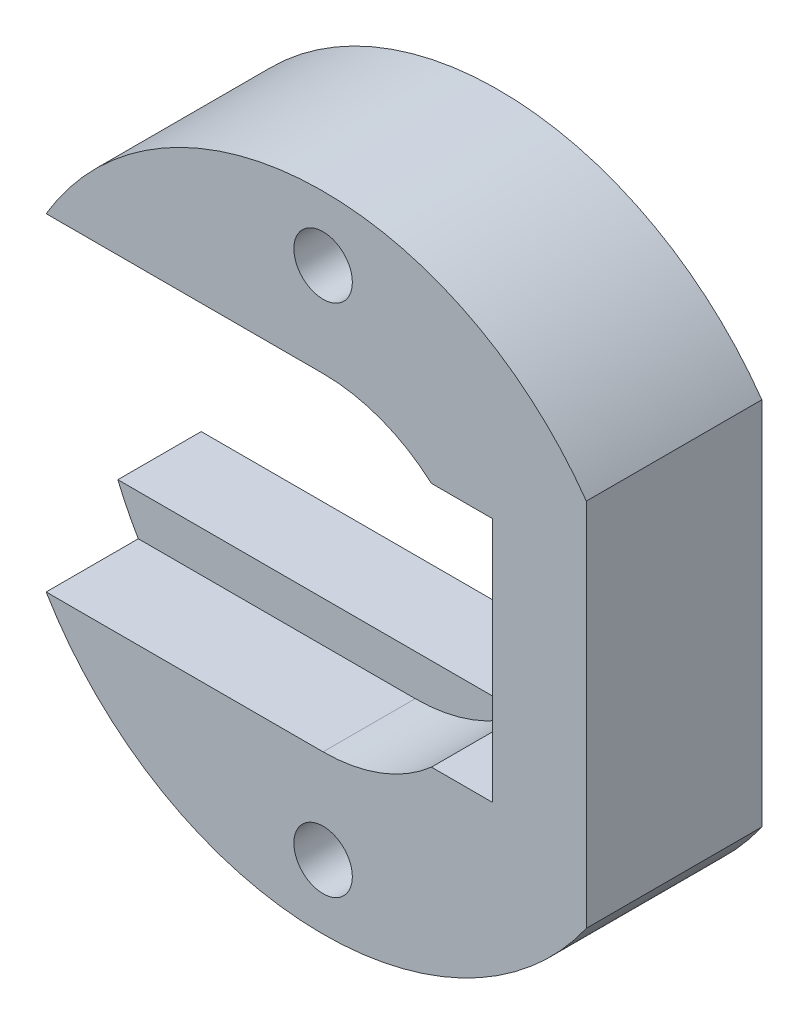
ISO-10303-21;
HEADER;
FILE_DESCRIPTION(('STEP AP214'),'2;1');
FILE_NAME('part.step','',(''),(''),'','','');
FILE_SCHEMA(('AUTOMOTIVE_DESIGN { 1 0 10303 214 1 1 1 1 }'));
ENDSEC;
DATA;
#1=APPLICATION_CONTEXT('core data for automotive mechanical design processes');
#2=APPLICATION_PROTOCOL_DEFINITION('international standard','automotive_design',2000,#1);
#3=PRODUCT_CONTEXT('',#1,'mechanical');
#4=PRODUCT('Part','Part','',(#3));
#5=PRODUCT_RELATED_PRODUCT_CATEGORY('part','',(#4));
#6=PRODUCT_DEFINITION_FORMATION('','',#4);
#7=PRODUCT_DEFINITION_CONTEXT('part definition',#1,'design');
#8=PRODUCT_DEFINITION('design','',#6,#7);
#9=PRODUCT_DEFINITION_SHAPE('','',#8);
#10=(LENGTH_UNIT() NAMED_UNIT(*) SI_UNIT(.MILLI.,.METRE.));
#11=(NAMED_UNIT(*) PLANE_ANGLE_UNIT() SI_UNIT($,.RADIAN.));
#12=(NAMED_UNIT(*) SI_UNIT($,.STERADIAN.) SOLID_ANGLE_UNIT());
#13=UNCERTAINTY_MEASURE_WITH_UNIT(LENGTH_MEASURE(1.E-05),#10,'distance_accuracy_value','');
#14=(GEOMETRIC_REPRESENTATION_CONTEXT(3) GLOBAL_UNCERTAINTY_ASSIGNED_CONTEXT((#13)) GLOBAL_UNIT_ASSIGNED_CONTEXT((#10,
#11,#12)) REPRESENTATION_CONTEXT('',''));
#15=CARTESIAN_POINT('',(0.,0.,0.));
#16=DIRECTION('',(0.,0.,1.));
#17=DIRECTION('',(1.,0.,0.));
#18=AXIS2_PLACEMENT_3D('',#15,#16,#17);
#19=CARTESIAN_POINT('',(-1.66533453693773E-13,0.,19.05));
#20=DIRECTION('',(0.,0.,-0.999999999999999));
#21=DIRECTION('',(-1.,0.,0.));
#22=AXIS2_PLACEMENT_3D('',#19,#20,#21);
#23=CYLINDRICAL_SURFACE('',#22,34.925);
#24=CARTESIAN_POINT('',(-1.66533453693773E-13,0.,19.05));
#25=DIRECTION('',(0.,0.,0.999999999999999));
#26=DIRECTION('',(1.,0.,0.));
#27=AXIS2_PLACEMENT_3D('',#24,#25,#26);
#28=CIRCLE('',#27,34.925);
#29=CARTESIAN_POINT('',(28.5749999999999,20.0804631420692,19.05));
#30=VERTEX_POINT('',#29);
#31=CARTESIAN_POINT('',(-30.0603929615036,17.78,19.05));
#32=VERTEX_POINT('',#31);
#33=EDGE_CURVE('E134',#30,#32,#28,.T.);
#34=ORIENTED_EDGE('',*,*,#33,.F.);
#35=DIRECTION('',(0.,0.,-0.999999999999999));
#36=VECTOR('',#35,1.);
#37=CARTESIAN_POINT('',(28.5749999999999,20.0804631420692,19.05));
#38=LINE('',#37,#36);
#39=CARTESIAN_POINT('',(28.575,20.0804631420692,0.));
#40=VERTEX_POINT('',#39);
#41=EDGE_CURVE('E122',#30,#40,#38,.T.);
#42=ORIENTED_EDGE('',*,*,#41,.T.);
#43=CARTESIAN_POINT('',(0.,0.,0.));
#44=DIRECTION('',(0.,0.,0.999999999999999));
#45=DIRECTION('',(1.,0.,0.));
#46=AXIS2_PLACEMENT_3D('',#43,#44,#45);
#47=CIRCLE('',#46,34.925);
#48=CARTESIAN_POINT('',(-32.2789931689328,13.335,0.));
#49=VERTEX_POINT('',#48);
#50=EDGE_CURVE('E131',#40,#49,#47,.T.);
#51=ORIENTED_EDGE('',*,*,#50,.T.);
#52=DIRECTION('',(0.,0.,-0.999999999999999));
#53=VECTOR('',#52,1.);
#54=CARTESIAN_POINT('',(-32.2789931689328,13.335,19.05));
#55=LINE('',#54,#53);
#56=CARTESIAN_POINT('',(-32.278993168933,13.335,9.05000000000002));
#57=VERTEX_POINT('',#56);
#58=EDGE_CURVE('E143',#49,#57,#55,.F.);
#59=ORIENTED_EDGE('',*,*,#58,.T.);
#60=CARTESIAN_POINT('',(-1.66533453693773E-13,0.,9.05));
#61=DIRECTION('',(0.,0.,0.999999999999999));
#62=DIRECTION('',(1.,0.,0.));
#63=AXIS2_PLACEMENT_3D('',#60,#61,#62);
#64=CIRCLE('',#63,34.925);
#65=CARTESIAN_POINT('',(-30.0603929615036,17.7799999999999,9.05));
#66=VERTEX_POINT('',#65);
#67=EDGE_CURVE('E56',#66,#57,#64,.T.);
#68=ORIENTED_EDGE('',*,*,#67,.F.);
#69=DIRECTION('',(0.,0.,-0.999999999999999));
#70=VECTOR('',#69,1.);
#71=CARTESIAN_POINT('',(-30.0603929615036,17.78,19.05));
#72=LINE('',#71,#70);
#73=EDGE_CURVE('E190',#66,#32,#72,.F.);
#74=ORIENTED_EDGE('',*,*,#73,.T.);
#75=EDGE_LOOP('',(#34,#42,#51,#59,#68,#74));
#76=FACE_BOUND('',#75,.T.);
#77=ADVANCED_FACE('F34',(#76),#23,.T.);
#78=CARTESIAN_POINT('',(-32.2789931689327,-13.335,0.));
#79=VERTEX_POINT('',#78);
#80=CARTESIAN_POINT('',(28.5749999999999,-20.0804631420691,0.));
#81=VERTEX_POINT('',#80);
#82=EDGE_CURVE('E142',#79,#81,#47,.T.);
#83=ORIENTED_EDGE('',*,*,#82,.T.);
#84=DIRECTION('',(0.,0.,-0.999999999999999));
#85=VECTOR('',#84,1.);
#86=CARTESIAN_POINT('',(28.5749999999997,-20.0804631420692,19.05));
#87=LINE('',#86,#85);
#88=CARTESIAN_POINT('',(28.5749999999997,-20.0804631420692,19.05));
#89=VERTEX_POINT('',#88);
#90=EDGE_CURVE('E49',#81,#89,#87,.F.);
#91=ORIENTED_EDGE('',*,*,#90,.T.);
#92=CARTESIAN_POINT('',(-30.0603929615035,-17.78,19.05));
#93=VERTEX_POINT('',#92);
#94=EDGE_CURVE('E149',#93,#89,#28,.T.);
#95=ORIENTED_EDGE('',*,*,#94,.F.);
#96=DIRECTION('',(0.,0.,-0.999999999999999));
#97=VECTOR('',#96,1.);
#98=CARTESIAN_POINT('',(-30.0603929615035,-17.78,19.05));
#99=LINE('',#98,#97);
#100=CARTESIAN_POINT('',(-30.0603929615035,-17.78,9.05));
#101=VERTEX_POINT('',#100);
#102=EDGE_CURVE('E168',#93,#101,#99,.T.);
#103=ORIENTED_EDGE('',*,*,#102,.T.);
#104=CARTESIAN_POINT('',(-32.2789931689328,-13.335,9.05));
#105=VERTEX_POINT('',#104);
#106=EDGE_CURVE('E157',#105,#101,#64,.T.);
#107=ORIENTED_EDGE('',*,*,#106,.F.);
#108=DIRECTION('',(0.,0.,-0.999999999999999));
#109=VECTOR('',#108,1.);
#110=CARTESIAN_POINT('',(-32.2789931689328,-13.335,19.05));
#111=LINE('',#110,#109);
#112=EDGE_CURVE('E145',#105,#79,#111,.T.);
#113=ORIENTED_EDGE('',*,*,#112,.T.);
#114=EDGE_LOOP('',(#83,#91,#95,#103,#107,#113));
#115=FACE_BOUND('',#114,.T.);
#116=ADVANCED_FACE('F36',(#115),#23,.T.);
#117=CARTESIAN_POINT('',(-1.66533453693773E-13,0.,19.05));
#118=DIRECTION('',(0.,0.,0.999999999999999));
#119=DIRECTION('',(1.,0.,0.));
#120=AXIS2_PLACEMENT_3D('',#117,#118,#119);
#121=PLANE('',#120);
#122=DIRECTION('',(0.,-1.,0.));
#123=VECTOR('',#122,1.);
#124=CARTESIAN_POINT('',(28.5749999999999,0.,19.05));
#125=LINE('',#124,#123);
#126=EDGE_CURVE('E232',#30,#89,#125,.T.);
#127=ORIENTED_EDGE('',*,*,#126,.F.);
#128=ORIENTED_EDGE('',*,*,#33,.T.);
#129=DIRECTION('',(-1.,0.,0.));
#130=VECTOR('',#129,1.);
#131=CARTESIAN_POINT('',(-3.33066907387547E-13,17.78,19.05));
#132=LINE('',#131,#130);
#133=CARTESIAN_POINT('',(-3.33066907387547E-13,17.78,19.05));
#134=VERTEX_POINT('',#133);
#135=EDGE_CURVE('E201',#134,#32,#132,.T.);
#136=ORIENTED_EDGE('',*,*,#135,.F.);
#137=CARTESIAN_POINT('',(-1.66533453693773E-13,0.,19.05));
#138=DIRECTION('',(0.,0.,0.999999999999999));
#139=DIRECTION('',(1.,0.,0.));
#140=AXIS2_PLACEMENT_3D('',#137,#138,#139);
#141=CIRCLE('',#140,17.78);
#142=CARTESIAN_POINT('',(11.7603645776819,13.335,19.05));
#143=VERTEX_POINT('',#142);
#144=EDGE_CURVE('E216',#143,#134,#141,.T.);
#145=ORIENTED_EDGE('',*,*,#144,.F.);
#146=DIRECTION('',(-1.,0.,0.));
#147=VECTOR('',#146,1.);
#148=CARTESIAN_POINT('',(18.4149999999998,13.335,19.05));
#149=LINE('',#148,#147);
#150=CARTESIAN_POINT('',(18.4149999999998,13.335,19.05));
#151=VERTEX_POINT('',#150);
#152=EDGE_CURVE('E181',#151,#143,#149,.T.);
#153=ORIENTED_EDGE('',*,*,#152,.F.);
#154=DIRECTION('',(0.,1.,0.));
#155=VECTOR('',#154,1.);
#156=CARTESIAN_POINT('',(18.4149999999998,-13.335,19.05));
#157=LINE('',#156,#155);
#158=CARTESIAN_POINT('',(18.4149999999998,-13.335,19.05));
#159=VERTEX_POINT('',#158);
#160=EDGE_CURVE('E185',#159,#151,#157,.T.);
#161=ORIENTED_EDGE('',*,*,#160,.F.);
#162=DIRECTION('',(1.,0.,0.));
#163=VECTOR('',#162,1.);
#164=CARTESIAN_POINT('',(18.4149999999998,-13.335,19.05));
#165=LINE('',#164,#163);
#166=CARTESIAN_POINT('',(11.7603645776819,-13.335,19.05));
#167=VERTEX_POINT('',#166);
#168=EDGE_CURVE('E188',#167,#159,#165,.T.);
#169=ORIENTED_EDGE('',*,*,#168,.F.);
#170=CARTESIAN_POINT('',(-1.66533453693773E-13,-17.78,19.05));
#171=VERTEX_POINT('',#170);
#172=EDGE_CURVE('E218',#171,#167,#141,.T.);
#173=ORIENTED_EDGE('',*,*,#172,.F.);
#174=DIRECTION('',(1.,0.,0.));
#175=VECTOR('',#174,1.);
#176=CARTESIAN_POINT('',(-1.66533453693773E-13,-17.78,19.05));
#177=LINE('',#176,#175);
#178=EDGE_CURVE('E205',#93,#171,#177,.T.);
#179=ORIENTED_EDGE('',*,*,#178,.F.);
#180=ORIENTED_EDGE('',*,*,#94,.T.);
#181=EDGE_LOOP('',(#127,#128,#136,#145,#153,#161,#169,#173,#179,#180));
#182=FACE_BOUND('',#181,.T.);
#183=CARTESIAN_POINT('',(-1.66533453693773E-13,27.94,19.05));
#184=DIRECTION('',(0.,0.,0.999999999999999));
#185=DIRECTION('',(1.,0.,0.));
#186=AXIS2_PLACEMENT_3D('',#183,#184,#185);
#187=CIRCLE('',#186,3.175);
#188=CARTESIAN_POINT('',(3.175,27.94,19.05));
#189=VERTEX_POINT('',#188);
#190=EDGE_CURVE('E220',#189,#189,#187,.T.);
#191=ORIENTED_EDGE('',*,*,#190,.F.);
#192=EDGE_LOOP('',(#191));
#193=FACE_BOUND('',#192,.T.);
#194=CARTESIAN_POINT('',(-1.66533453693773E-13,-27.94,19.05));
#195=DIRECTION('',(0.,0.,0.999999999999999));
#196=DIRECTION('',(1.,0.,0.));
#197=AXIS2_PLACEMENT_3D('',#194,#195,#196);
#198=CIRCLE('',#197,3.175);
#199=CARTESIAN_POINT('',(3.17499999999983,-27.94,19.05));
#200=VERTEX_POINT('',#199);
#201=EDGE_CURVE('E223',#200,#200,#198,.T.);
#202=ORIENTED_EDGE('',*,*,#201,.F.);
#203=EDGE_LOOP('',(#202));
#204=FACE_BOUND('',#203,.T.);
#205=ADVANCED_FACE('F236',(#182,#193,#204),#121,.T.);
#206=CARTESIAN_POINT('',(0.,0.,0.));
#207=DIRECTION('',(0.,0.,0.999999999999999));
#208=DIRECTION('',(1.,0.,0.));
#209=AXIS2_PLACEMENT_3D('',#206,#207,#208);
#210=PLANE('',#209);
#211=CARTESIAN_POINT('',(0.,27.94,0.));
#212=DIRECTION('',(0.,0.,0.999999999999999));
#213=DIRECTION('',(1.,0.,0.));
#214=AXIS2_PLACEMENT_3D('',#211,#212,#213);
#215=CIRCLE('',#214,3.175);
#216=CARTESIAN_POINT('',(3.175,27.94,0.));
#217=VERTEX_POINT('',#216);
#218=EDGE_CURVE('E226',#217,#217,#215,.T.);
#219=ORIENTED_EDGE('',*,*,#218,.T.);
#220=EDGE_LOOP('',(#219));
#221=FACE_BOUND('',#220,.T.);
#222=CARTESIAN_POINT('',(-1.66533453693773E-13,-27.94,0.));
#223=DIRECTION('',(0.,0.,0.999999999999999));
#224=DIRECTION('',(1.,0.,0.));
#225=AXIS2_PLACEMENT_3D('',#222,#223,#224);
#226=CIRCLE('',#225,3.175);
#227=CARTESIAN_POINT('',(3.17499999999983,-27.94,0.));
#228=VERTEX_POINT('',#227);
#229=EDGE_CURVE('E135',#228,#228,#226,.T.);
#230=ORIENTED_EDGE('',*,*,#229,.T.);
#231=EDGE_LOOP('',(#230));
#232=FACE_BOUND('',#231,.T.);
#233=ORIENTED_EDGE('',*,*,#50,.F.);
#234=DIRECTION('',(0.,-1.,0.));
#235=VECTOR('',#234,1.);
#236=CARTESIAN_POINT('',(28.575,0.,0.));
#237=LINE('',#236,#235);
#238=EDGE_CURVE('E11',#40,#81,#237,.T.);
#239=ORIENTED_EDGE('',*,*,#238,.T.);
#240=ORIENTED_EDGE('',*,*,#82,.F.);
#241=DIRECTION('',(1.,0.,0.));
#242=VECTOR('',#241,1.);
#243=CARTESIAN_POINT('',(0.,-13.335,0.));
#244=LINE('',#243,#242);
#245=CARTESIAN_POINT('',(18.415,-13.335,0.));
#246=VERTEX_POINT('',#245);
#247=EDGE_CURVE('E150',#79,#246,#244,.T.);
#248=ORIENTED_EDGE('',*,*,#247,.T.);
#249=DIRECTION('',(0.,1.,0.));
#250=VECTOR('',#249,1.);
#251=CARTESIAN_POINT('',(18.415,-13.335,0.));
#252=LINE('',#251,#250);
#253=CARTESIAN_POINT('',(18.4149999999998,13.335,0.));
#254=VERTEX_POINT('',#253);
#255=EDGE_CURVE('E184',#246,#254,#252,.T.);
#256=ORIENTED_EDGE('',*,*,#255,.T.);
#257=DIRECTION('',(-1.,0.,0.));
#258=VECTOR('',#257,1.);
#259=CARTESIAN_POINT('',(18.4149999999998,13.335,0.));
#260=LINE('',#259,#258);
#261=EDGE_CURVE('E141',#254,#49,#260,.T.);
#262=ORIENTED_EDGE('',*,*,#261,.T.);
#263=EDGE_LOOP('',(#233,#239,#240,#248,#256,#262));
#264=FACE_BOUND('',#263,.T.);
#265=ADVANCED_FACE('F138',(#221,#232,#264),#210,.F.);
#266=CARTESIAN_POINT('',(18.4149999999998,13.335,0.));
#267=DIRECTION('',(0.,1.,0.));
#268=DIRECTION('',(-1.,0.,0.));
#269=AXIS2_PLACEMENT_3D('',#266,#267,#268);
#270=PLANE('',#269);
#271=ORIENTED_EDGE('',*,*,#152,.T.);
#272=DIRECTION('',(0.,0.,0.999999999999999));
#273=VECTOR('',#272,1.);
#274=CARTESIAN_POINT('',(11.7603645776818,13.335,9.05000000000004));
#275=LINE('',#274,#273);
#276=CARTESIAN_POINT('',(11.7603645776818,13.335,9.05000000000004));
#277=VERTEX_POINT('',#276);
#278=EDGE_CURVE('E208',#143,#277,#275,.F.);
#279=ORIENTED_EDGE('',*,*,#278,.T.);
#280=DIRECTION('',(1.,0.,0.));
#281=VECTOR('',#280,1.);
#282=CARTESIAN_POINT('',(18.4149999999997,13.335,9.05));
#283=LINE('',#282,#281);
#284=EDGE_CURVE('E169',#57,#277,#283,.T.);
#285=ORIENTED_EDGE('',*,*,#284,.F.);
#286=ORIENTED_EDGE('',*,*,#58,.F.);
#287=ORIENTED_EDGE('',*,*,#261,.F.);
#288=DIRECTION('',(0.,0.,0.999999999999999));
#289=VECTOR('',#288,1.);
#290=CARTESIAN_POINT('',(18.4149999999998,13.335,0.));
#291=LINE('',#290,#289);
#292=EDGE_CURVE('E174',#254,#151,#291,.T.);
#293=ORIENTED_EDGE('',*,*,#292,.T.);
#294=EDGE_LOOP('',(#271,#279,#285,#286,#287,#293));
#295=FACE_BOUND('',#294,.T.);
#296=ADVANCED_FACE('F246',(#295),#270,.F.);
#297=CARTESIAN_POINT('',(18.415,-13.335,0.));
#298=DIRECTION('',(0.,-1.,0.));
#299=DIRECTION('',(1.,0.,0.));
#300=AXIS2_PLACEMENT_3D('',#297,#298,#299);
#301=PLANE('',#300);
#302=DIRECTION('',(-1.,0.,0.));
#303=VECTOR('',#302,1.);
#304=CARTESIAN_POINT('',(18.4149999999998,-13.335,9.05));
#305=LINE('',#304,#303);
#306=CARTESIAN_POINT('',(11.7603645776819,-13.335,9.05000000000002));
#307=VERTEX_POINT('',#306);
#308=EDGE_CURVE('E42',#307,#105,#305,.T.);
#309=ORIENTED_EDGE('',*,*,#308,.F.);
#310=DIRECTION('',(0.,0.,0.999999999999999));
#311=VECTOR('',#310,1.);
#312=CARTESIAN_POINT('',(11.7603645776819,-13.335,9.05000000000002));
#313=LINE('',#312,#311);
#314=EDGE_CURVE('E213',#307,#167,#313,.T.);
#315=ORIENTED_EDGE('',*,*,#314,.T.);
#316=ORIENTED_EDGE('',*,*,#168,.T.);
#317=DIRECTION('',(0.,0.,0.999999999999999));
#318=VECTOR('',#317,1.);
#319=CARTESIAN_POINT('',(18.415,-13.335,0.));
#320=LINE('',#319,#318);
#321=EDGE_CURVE('E176',#246,#159,#320,.T.);
#322=ORIENTED_EDGE('',*,*,#321,.F.);
#323=ORIENTED_EDGE('',*,*,#247,.F.);
#324=ORIENTED_EDGE('',*,*,#112,.F.);
#325=EDGE_LOOP('',(#309,#315,#316,#322,#323,#324));
#326=FACE_BOUND('',#325,.T.);
#327=ADVANCED_FACE('F172',(#326),#301,.F.);
#328=CARTESIAN_POINT('',(18.415,-13.335,0.));
#329=DIRECTION('',(1.,0.,0.));
#330=DIRECTION('',(0.,0.,-0.999999999999999));
#331=AXIS2_PLACEMENT_3D('',#328,#329,#330);
#332=PLANE('',#331);
#333=ORIENTED_EDGE('',*,*,#160,.T.);
#334=ORIENTED_EDGE('',*,*,#292,.F.);
#335=ORIENTED_EDGE('',*,*,#255,.F.);
#336=ORIENTED_EDGE('',*,*,#321,.T.);
#337=EDGE_LOOP('',(#333,#334,#335,#336));
#338=FACE_BOUND('',#337,.T.);
#339=ADVANCED_FACE('F254',(#338),#332,.F.);
#340=CARTESIAN_POINT('',(-1.66533453693773E-13,0.,9.05));
#341=DIRECTION('',(0.,0.,0.999999999999999));
#342=DIRECTION('',(1.,0.,0.));
#343=AXIS2_PLACEMENT_3D('',#340,#341,#342);
#344=PLANE('',#343);
#345=DIRECTION('',(1.,0.,0.));
#346=VECTOR('',#345,1.);
#347=CARTESIAN_POINT('',(-1.66533453693773E-13,-17.78,9.05));
#348=LINE('',#347,#346);
#349=CARTESIAN_POINT('',(-1.66533453693773E-13,-17.78,9.05));
#350=VERTEX_POINT('',#349);
#351=EDGE_CURVE('E204',#101,#350,#348,.T.);
#352=ORIENTED_EDGE('',*,*,#351,.T.);
#353=CARTESIAN_POINT('',(-1.66533453693773E-13,0.,9.05));
#354=DIRECTION('',(0.,0.,0.999999999999999));
#355=DIRECTION('',(1.,0.,0.));
#356=AXIS2_PLACEMENT_3D('',#353,#354,#355);
#357=CIRCLE('',#356,17.78);
#358=EDGE_CURVE('E159',#350,#307,#357,.T.);
#359=ORIENTED_EDGE('',*,*,#358,.T.);
#360=ORIENTED_EDGE('',*,*,#308,.T.);
#361=ORIENTED_EDGE('',*,*,#106,.T.);
#362=EDGE_LOOP('',(#352,#359,#360,#361));
#363=FACE_BOUND('',#362,.T.);
#364=ADVANCED_FACE('F156',(#363),#344,.T.);
#365=CARTESIAN_POINT('',(-1.66533453693773E-13,-17.78,9.05));
#366=DIRECTION('',(0.,-1.,0.));
#367=DIRECTION('',(1.,0.,0.));
#368=AXIS2_PLACEMENT_3D('',#365,#366,#367);
#369=PLANE('',#368);
#370=ORIENTED_EDGE('',*,*,#178,.T.);
#371=DIRECTION('',(0.,0.,0.999999999999999));
#372=VECTOR('',#371,1.);
#373=CARTESIAN_POINT('',(-1.66533453693773E-13,-17.78,9.05));
#374=LINE('',#373,#372);
#375=EDGE_CURVE('E196',#350,#171,#374,.T.);
#376=ORIENTED_EDGE('',*,*,#375,.F.);
#377=ORIENTED_EDGE('',*,*,#351,.F.);
#378=ORIENTED_EDGE('',*,*,#102,.F.);
#379=EDGE_LOOP('',(#370,#376,#377,#378));
#380=FACE_BOUND('',#379,.T.);
#381=ADVANCED_FACE('F260',(#380),#369,.F.);
#382=CARTESIAN_POINT('',(-3.33066907387547E-13,17.78,9.05));
#383=DIRECTION('',(0.,1.,0.));
#384=DIRECTION('',(-1.,0.,0.));
#385=AXIS2_PLACEMENT_3D('',#382,#383,#384);
#386=PLANE('',#385);
#387=DIRECTION('',(-1.,0.,0.));
#388=VECTOR('',#387,1.);
#389=CARTESIAN_POINT('',(-3.33066907387547E-13,17.78,9.05));
#390=LINE('',#389,#388);
#391=CARTESIAN_POINT('',(-3.33066907387547E-13,17.78,9.05));
#392=VERTEX_POINT('',#391);
#393=EDGE_CURVE('E198',#392,#66,#390,.T.);
#394=ORIENTED_EDGE('',*,*,#393,.F.);
#395=DIRECTION('',(0.,0.,0.999999999999999));
#396=VECTOR('',#395,1.);
#397=CARTESIAN_POINT('',(-3.33066907387547E-13,17.78,9.05));
#398=LINE('',#397,#396);
#399=EDGE_CURVE('E170',#392,#134,#398,.T.);
#400=ORIENTED_EDGE('',*,*,#399,.T.);
#401=ORIENTED_EDGE('',*,*,#135,.T.);
#402=ORIENTED_EDGE('',*,*,#73,.F.);
#403=EDGE_LOOP('',(#394,#400,#401,#402));
#404=FACE_BOUND('',#403,.T.);
#405=ADVANCED_FACE('F243',(#404),#386,.F.);
#406=ORIENTED_EDGE('',*,*,#284,.T.);
#407=EDGE_CURVE('E215',#277,#392,#357,.T.);
#408=ORIENTED_EDGE('',*,*,#407,.T.);
#409=ORIENTED_EDGE('',*,*,#393,.T.);
#410=ORIENTED_EDGE('',*,*,#67,.T.);
#411=EDGE_LOOP('',(#406,#408,#409,#410));
#412=FACE_BOUND('',#411,.T.);
#413=ADVANCED_FACE('F248',(#412),#344,.T.);
#414=CARTESIAN_POINT('',(-1.66533453693773E-13,0.,9.05));
#415=DIRECTION('',(0.,0.,0.999999999999999));
#416=DIRECTION('',(1.,0.,0.));
#417=AXIS2_PLACEMENT_3D('',#414,#415,#416);
#418=CYLINDRICAL_SURFACE('',#417,17.78);
#419=ORIENTED_EDGE('',*,*,#144,.T.);
#420=ORIENTED_EDGE('',*,*,#399,.F.);
#421=ORIENTED_EDGE('',*,*,#407,.F.);
#422=ORIENTED_EDGE('',*,*,#278,.F.);
#423=EDGE_LOOP('',(#419,#420,#421,#422));
#424=FACE_BOUND('',#423,.T.);
#425=ADVANCED_FACE('F250',(#424),#418,.F.);
#426=ORIENTED_EDGE('',*,*,#358,.F.);
#427=ORIENTED_EDGE('',*,*,#375,.T.);
#428=ORIENTED_EDGE('',*,*,#172,.T.);
#429=ORIENTED_EDGE('',*,*,#314,.F.);
#430=EDGE_LOOP('',(#426,#427,#428,#429));
#431=FACE_BOUND('',#430,.T.);
#432=ADVANCED_FACE('F257',(#431),#418,.F.);
#433=CARTESIAN_POINT('',(-1.66533453693773E-13,-27.94,0.));
#434=DIRECTION('',(0.,0.,0.999999999999999));
#435=DIRECTION('',(1.,0.,0.));
#436=AXIS2_PLACEMENT_3D('',#433,#434,#435);
#437=CYLINDRICAL_SURFACE('',#436,3.175);
#438=CARTESIAN_POINT('',(3.17499999999983,-27.94,19.05));
#439=CARTESIAN_POINT('',(3.17499999999983,-27.94,18.8515625));
#440=CARTESIAN_POINT('',(3.17499999999983,-27.94,18.653125));
#441=CARTESIAN_POINT('',(3.17499999999983,-27.94,18.25625));
#442=CARTESIAN_POINT('',(3.17499999999983,-27.94,18.0578125));
#443=CARTESIAN_POINT('',(3.17499999999983,-27.94,17.6609375));
#444=CARTESIAN_POINT('',(3.17499999999983,-27.94,17.4625));
#445=CARTESIAN_POINT('',(3.17499999999983,-27.94,17.065625));
#446=CARTESIAN_POINT('',(3.17499999999983,-27.94,16.8671875));
#447=CARTESIAN_POINT('',(3.17499999999983,-27.94,16.4703125));
#448=CARTESIAN_POINT('',(3.17499999999983,-27.94,16.271875));
#449=CARTESIAN_POINT('',(3.17499999999983,-27.94,15.875));
#450=CARTESIAN_POINT('',(3.17499999999983,-27.94,15.6765625));
#451=CARTESIAN_POINT('',(3.17499999999983,-27.94,15.2796875));
#452=CARTESIAN_POINT('',(3.17499999999983,-27.94,15.08125));
#453=CARTESIAN_POINT('',(3.17499999999983,-27.94,14.684375));
#454=CARTESIAN_POINT('',(3.17499999999983,-27.94,14.4859375));
#455=CARTESIAN_POINT('',(3.17499999999983,-27.94,14.0890625));
#456=CARTESIAN_POINT('',(3.17499999999983,-27.94,13.890625));
#457=CARTESIAN_POINT('',(3.17499999999983,-27.94,13.49375));
#458=CARTESIAN_POINT('',(3.17499999999983,-27.94,13.2953125));
#459=CARTESIAN_POINT('',(3.17499999999983,-27.94,12.8984375));
#460=CARTESIAN_POINT('',(3.17499999999983,-27.94,12.7));
#461=CARTESIAN_POINT('',(3.17499999999983,-27.94,12.303125));
#462=CARTESIAN_POINT('',(3.17499999999983,-27.94,12.1046875));
#463=CARTESIAN_POINT('',(3.17499999999983,-27.94,11.7078125));
#464=CARTESIAN_POINT('',(3.17499999999983,-27.94,11.509375));
#465=CARTESIAN_POINT('',(3.17499999999983,-27.94,11.1125));
#466=CARTESIAN_POINT('',(3.17499999999983,-27.94,10.9140625));
#467=CARTESIAN_POINT('',(3.17499999999983,-27.94,10.5171875));
#468=CARTESIAN_POINT('',(3.17499999999983,-27.94,10.31875));
#469=CARTESIAN_POINT('',(3.17499999999983,-27.94,9.921875));
#470=CARTESIAN_POINT('',(3.17499999999983,-27.94,9.7234375));
#471=CARTESIAN_POINT('',(3.17499999999983,-27.94,9.3265625));
#472=CARTESIAN_POINT('',(3.17499999999983,-27.94,9.128125));
#473=CARTESIAN_POINT('',(3.17499999999983,-27.94,8.73125));
#474=CARTESIAN_POINT('',(3.17499999999983,-27.94,8.5328125));
#475=CARTESIAN_POINT('',(3.17499999999983,-27.94,8.1359375));
#476=CARTESIAN_POINT('',(3.17499999999983,-27.94,7.9375));
#477=CARTESIAN_POINT('',(3.17499999999983,-27.94,7.540625));
#478=CARTESIAN_POINT('',(3.17499999999983,-27.94,7.3421875));
#479=CARTESIAN_POINT('',(3.17499999999983,-27.94,6.9453125));
#480=CARTESIAN_POINT('',(3.17499999999983,-27.94,6.746875));
#481=CARTESIAN_POINT('',(3.17499999999983,-27.94,6.35));
#482=CARTESIAN_POINT('',(3.17499999999983,-27.94,6.1515625));
#483=CARTESIAN_POINT('',(3.17499999999983,-27.94,5.7546875));
#484=CARTESIAN_POINT('',(3.17499999999983,-27.94,5.55625));
#485=CARTESIAN_POINT('',(3.17499999999983,-27.94,5.159375));
#486=CARTESIAN_POINT('',(3.17499999999983,-27.94,4.9609375));
#487=CARTESIAN_POINT('',(3.17499999999983,-27.94,4.5640625));
#488=CARTESIAN_POINT('',(3.17499999999983,-27.94,4.365625));
#489=CARTESIAN_POINT('',(3.17499999999983,-27.94,3.96875));
#490=CARTESIAN_POINT('',(3.17499999999983,-27.94,3.7703125));
#491=CARTESIAN_POINT('',(3.17499999999983,-27.94,3.3734375));
#492=CARTESIAN_POINT('',(3.17499999999983,-27.94,3.175));
#493=CARTESIAN_POINT('',(3.17499999999983,-27.94,2.778125));
#494=CARTESIAN_POINT('',(3.17499999999983,-27.94,2.5796875));
#495=CARTESIAN_POINT('',(3.17499999999983,-27.94,2.1828125));
#496=CARTESIAN_POINT('',(3.17499999999983,-27.94,1.984375));
#497=CARTESIAN_POINT('',(3.17499999999983,-27.94,1.5875));
#498=CARTESIAN_POINT('',(3.17499999999983,-27.94,1.3890625));
#499=CARTESIAN_POINT('',(3.17499999999983,-27.94,0.9921875));
#500=CARTESIAN_POINT('',(3.17499999999983,-27.94,0.79375));
#501=CARTESIAN_POINT('',(3.17499999999983,-27.94,0.396875));
#502=CARTESIAN_POINT('',(3.17499999999983,-27.94,0.1984375));
#503=CARTESIAN_POINT('',(3.17499999999983,-27.94,0.));
#504=B_SPLINE_CURVE_WITH_KNOTS('',3,(#438,#439,#440,#441,#442,#443,#444,#445,#446,#447,#448,
#449,#450,#451,#452,#453,#454,#455,#456,#457,#458,#459,#460,#461,#462,#463,#464,#465,#466,#467,
#468,#469,#470,#471,#472,#473,#474,#475,#476,#477,#478,#479,#480,#481,#482,#483,#484,#485,#486,
#487,#488,#489,#490,#491,#492,#493,#494,#495,#496,#497,#498,#499,#500,#501,#502,#503),
.UNSPECIFIED.,.F.,.F.,(4,2,2,2,2,2,2,2,2,2,2,2,2,2,2,2,2,2,2,2,2,2,2,2,2,2,2,2,2,2,2,2,4),(0.,
0.5953125,1.190625,1.7859375,2.38125,2.9765625,3.571875,4.1671875,4.7625,5.3578125,5.953125,
6.5484375,7.14375,7.7390625,8.334375,8.9296875,9.525,10.1203125,10.715625,11.3109375,11.90625,
12.5015625,13.096875,13.6921875,14.2875,14.8828125,15.478125,16.0734375,16.66875,17.2640625,
17.859375,18.4546875,19.05),.UNSPECIFIED.);
#505=EDGE_CURVE('BSEAM328',#200,#228,#504,.T.);
#506=ORIENTED_EDGE('',*,*,#201,.T.);
#507=ORIENTED_EDGE('',*,*,#229,.F.);
#508=ORIENTED_EDGE('',*,*,#505,.T.);
#509=ORIENTED_EDGE('',*,*,#505,.F.);
#510=EDGE_LOOP('',(#506,#508,#507,#509));
#511=FACE_BOUND('',#510,.T.);
#512=ADVANCED_FACE('F328',(#511),#437,.F.);
#513=CARTESIAN_POINT('',(0.,27.94,0.));
#514=DIRECTION('',(0.,0.,0.999999999999999));
#515=DIRECTION('',(1.,0.,0.));
#516=AXIS2_PLACEMENT_3D('',#513,#514,#515);
#517=CYLINDRICAL_SURFACE('',#516,3.175);
#518=CARTESIAN_POINT('',(3.175,27.94,19.05));
#519=CARTESIAN_POINT('',(3.175,27.94,18.8515625));
#520=CARTESIAN_POINT('',(3.175,27.94,18.653125));
#521=CARTESIAN_POINT('',(3.175,27.94,18.25625));
#522=CARTESIAN_POINT('',(3.175,27.94,18.0578125));
#523=CARTESIAN_POINT('',(3.175,27.94,17.6609375));
#524=CARTESIAN_POINT('',(3.175,27.94,17.4625));
#525=CARTESIAN_POINT('',(3.175,27.94,17.065625));
#526=CARTESIAN_POINT('',(3.175,27.94,16.8671875));
#527=CARTESIAN_POINT('',(3.175,27.94,16.4703125));
#528=CARTESIAN_POINT('',(3.175,27.94,16.271875));
#529=CARTESIAN_POINT('',(3.175,27.94,15.875));
#530=CARTESIAN_POINT('',(3.175,27.94,15.6765625));
#531=CARTESIAN_POINT('',(3.175,27.94,15.2796875));
#532=CARTESIAN_POINT('',(3.175,27.94,15.08125));
#533=CARTESIAN_POINT('',(3.175,27.94,14.684375));
#534=CARTESIAN_POINT('',(3.175,27.94,14.4859375));
#535=CARTESIAN_POINT('',(3.175,27.94,14.0890625));
#536=CARTESIAN_POINT('',(3.175,27.94,13.890625));
#537=CARTESIAN_POINT('',(3.175,27.94,13.49375));
#538=CARTESIAN_POINT('',(3.175,27.94,13.2953125));
#539=CARTESIAN_POINT('',(3.175,27.94,12.8984375));
#540=CARTESIAN_POINT('',(3.175,27.94,12.7));
#541=CARTESIAN_POINT('',(3.175,27.94,12.303125));
#542=CARTESIAN_POINT('',(3.175,27.94,12.1046875));
#543=CARTESIAN_POINT('',(3.175,27.94,11.7078125));
#544=CARTESIAN_POINT('',(3.175,27.94,11.509375));
#545=CARTESIAN_POINT('',(3.175,27.94,11.1125));
#546=CARTESIAN_POINT('',(3.175,27.94,10.9140625));
#547=CARTESIAN_POINT('',(3.175,27.94,10.5171875));
#548=CARTESIAN_POINT('',(3.175,27.94,10.31875));
#549=CARTESIAN_POINT('',(3.175,27.94,9.921875));
#550=CARTESIAN_POINT('',(3.175,27.94,9.7234375));
#551=CARTESIAN_POINT('',(3.175,27.94,9.3265625));
#552=CARTESIAN_POINT('',(3.175,27.94,9.128125));
#553=CARTESIAN_POINT('',(3.175,27.94,8.73125));
#554=CARTESIAN_POINT('',(3.175,27.94,8.5328125));
#555=CARTESIAN_POINT('',(3.175,27.94,8.1359375));
#556=CARTESIAN_POINT('',(3.175,27.94,7.9375));
#557=CARTESIAN_POINT('',(3.175,27.94,7.540625));
#558=CARTESIAN_POINT('',(3.175,27.94,7.3421875));
#559=CARTESIAN_POINT('',(3.175,27.94,6.9453125));
#560=CARTESIAN_POINT('',(3.175,27.94,6.746875));
#561=CARTESIAN_POINT('',(3.175,27.94,6.35));
#562=CARTESIAN_POINT('',(3.175,27.94,6.1515625));
#563=CARTESIAN_POINT('',(3.175,27.94,5.7546875));
#564=CARTESIAN_POINT('',(3.175,27.94,5.55625));
#565=CARTESIAN_POINT('',(3.175,27.94,5.159375));
#566=CARTESIAN_POINT('',(3.175,27.94,4.9609375));
#567=CARTESIAN_POINT('',(3.175,27.94,4.5640625));
#568=CARTESIAN_POINT('',(3.175,27.94,4.365625));
#569=CARTESIAN_POINT('',(3.175,27.94,3.96875));
#570=CARTESIAN_POINT('',(3.175,27.94,3.7703125));
#571=CARTESIAN_POINT('',(3.175,27.94,3.3734375));
#572=CARTESIAN_POINT('',(3.175,27.94,3.175));
#573=CARTESIAN_POINT('',(3.175,27.94,2.778125));
#574=CARTESIAN_POINT('',(3.175,27.94,2.5796875));
#575=CARTESIAN_POINT('',(3.175,27.94,2.1828125));
#576=CARTESIAN_POINT('',(3.175,27.94,1.984375));
#577=CARTESIAN_POINT('',(3.175,27.94,1.5875));
#578=CARTESIAN_POINT('',(3.175,27.94,1.3890625));
#579=CARTESIAN_POINT('',(3.175,27.94,0.9921875));
#580=CARTESIAN_POINT('',(3.175,27.94,0.79375));
#581=CARTESIAN_POINT('',(3.175,27.94,0.396875));
#582=CARTESIAN_POINT('',(3.175,27.94,0.1984375));
#583=CARTESIAN_POINT('',(3.175,27.94,0.));
#584=B_SPLINE_CURVE_WITH_KNOTS('',3,(#518,#519,#520,#521,#522,#523,#524,#525,#526,#527,#528,
#529,#530,#531,#532,#533,#534,#535,#536,#537,#538,#539,#540,#541,#542,#543,#544,#545,#546,#547,
#548,#549,#550,#551,#552,#553,#554,#555,#556,#557,#558,#559,#560,#561,#562,#563,#564,#565,#566,
#567,#568,#569,#570,#571,#572,#573,#574,#575,#576,#577,#578,#579,#580,#581,#582,#583),
.UNSPECIFIED.,.F.,.F.,(4,2,2,2,2,2,2,2,2,2,2,2,2,2,2,2,2,2,2,2,2,2,2,2,2,2,2,2,2,2,2,2,4),(0.,
0.5953125,1.190625,1.7859375,2.38125,2.9765625,3.571875,4.1671875,4.7625,5.3578125,5.953125,
6.5484375,7.14375,7.7390625,8.334375,8.9296875,9.525,10.1203125,10.715625,11.3109375,11.90625,
12.5015625,13.096875,13.6921875,14.2875,14.8828125,15.478125,16.0734375,16.66875,17.2640625,
17.859375,18.4546875,19.05),.UNSPECIFIED.);
#585=EDGE_CURVE('BSEAM334',#189,#217,#584,.T.);
#586=ORIENTED_EDGE('',*,*,#190,.T.);
#587=ORIENTED_EDGE('',*,*,#218,.F.);
#588=ORIENTED_EDGE('',*,*,#585,.T.);
#589=ORIENTED_EDGE('',*,*,#585,.F.);
#590=EDGE_LOOP('',(#586,#588,#587,#589));
#591=FACE_BOUND('',#590,.T.);
#592=ADVANCED_FACE('F334',(#591),#517,.F.);
#593=CARTESIAN_POINT('',(28.575,-53.2845599481391,0.));
#594=DIRECTION('',(-1.,0.,0.));
#595=DIRECTION('',(0.,0.,0.999999999999999));
#596=AXIS2_PLACEMENT_3D('',#593,#594,#595);
#597=PLANE('',#596);
#598=ORIENTED_EDGE('',*,*,#126,.T.);
#599=ORIENTED_EDGE('',*,*,#90,.F.);
#600=ORIENTED_EDGE('',*,*,#238,.F.);
#601=ORIENTED_EDGE('',*,*,#41,.F.);
#602=EDGE_LOOP('',(#598,#599,#600,#601));
#603=FACE_BOUND('',#602,.T.);
#604=ADVANCED_FACE('F121',(#603),#597,.F.);
#605=CLOSED_SHELL('',(#77,#116,#205,#265,#296,#327,#339,#364,#381,#405,#413,#425,#432,#512,#592,#604));
#606=MANIFOLD_SOLID_BREP('B2',#605);
#607=ADVANCED_BREP_SHAPE_REPRESENTATION('',(#18,#606),#14);
#608=SHAPE_DEFINITION_REPRESENTATION(#9,#607);
ENDSEC;
END-ISO-10303-21;
